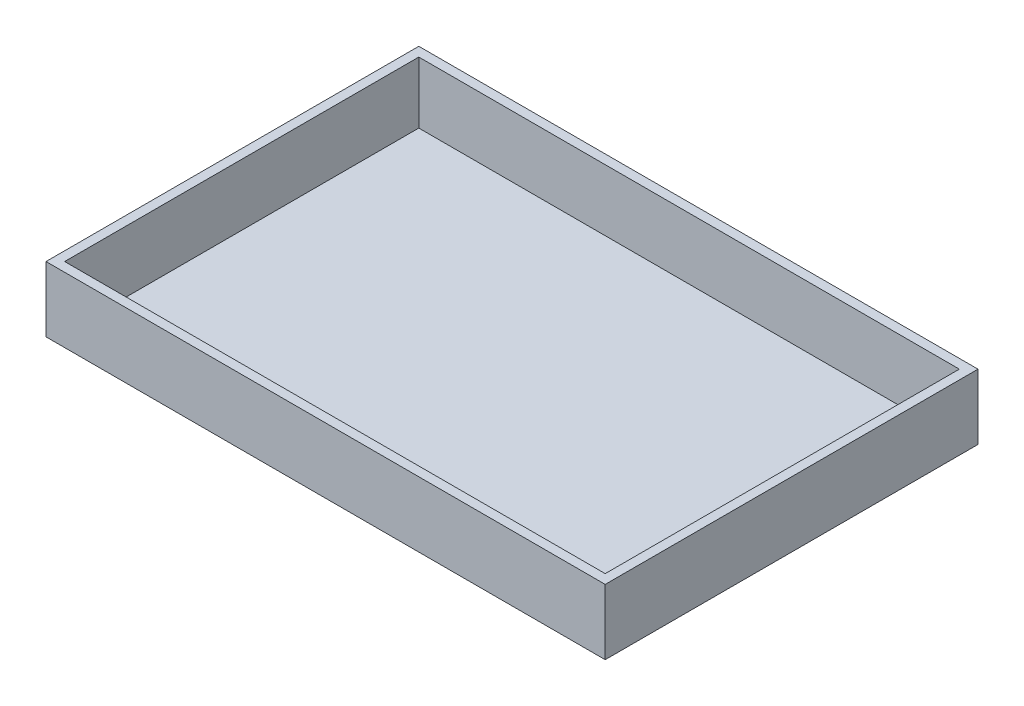
ISO-10303-21;
HEADER;
FILE_DESCRIPTION(('STEP AP214'),'2;1');
FILE_NAME('part.step','',(''),(''),'','','');
FILE_SCHEMA(('AUTOMOTIVE_DESIGN { 1 0 10303 214 1 1 1 1 }'));
ENDSEC;
DATA;
#1=APPLICATION_CONTEXT('core data for automotive mechanical design processes');
#2=APPLICATION_PROTOCOL_DEFINITION('international standard','automotive_design',2000,#1);
#3=PRODUCT_CONTEXT('',#1,'mechanical');
#4=PRODUCT('Part','Part','',(#3));
#5=PRODUCT_RELATED_PRODUCT_CATEGORY('part','',(#4));
#6=PRODUCT_DEFINITION_FORMATION('','',#4);
#7=PRODUCT_DEFINITION_CONTEXT('part definition',#1,'design');
#8=PRODUCT_DEFINITION('design','',#6,#7);
#9=PRODUCT_DEFINITION_SHAPE('','',#8);
#10=(LENGTH_UNIT() NAMED_UNIT(*) SI_UNIT(.MILLI.,.METRE.));
#11=(NAMED_UNIT(*) PLANE_ANGLE_UNIT() SI_UNIT($,.RADIAN.));
#12=(NAMED_UNIT(*) SI_UNIT($,.STERADIAN.) SOLID_ANGLE_UNIT());
#13=UNCERTAINTY_MEASURE_WITH_UNIT(LENGTH_MEASURE(1.E-05),#10,'distance_accuracy_value','');
#14=(GEOMETRIC_REPRESENTATION_CONTEXT(3) GLOBAL_UNCERTAINTY_ASSIGNED_CONTEXT((#13)) GLOBAL_UNIT_ASSIGNED_CONTEXT((#10,
#11,#12)) REPRESENTATION_CONTEXT('',''));
#15=CARTESIAN_POINT('',(0.,0.,0.));
#16=DIRECTION('',(0.,0.,1.));
#17=DIRECTION('',(1.,0.,0.));
#18=AXIS2_PLACEMENT_3D('',#15,#16,#17);
#19=CARTESIAN_POINT('',(-15.,-1.75,20.));
#20=DIRECTION('',(1.,0.,0.));
#21=DIRECTION('',(0.,0.,-1.));
#22=AXIS2_PLACEMENT_3D('',#19,#20,#21);
#23=PLANE('',#22);
#24=DIRECTION('',(0.,-1.,0.));
#25=VECTOR('',#24,1.);
#26=CARTESIAN_POINT('',(-15.,-1.75,0.));
#27=LINE('',#26,#25);
#28=CARTESIAN_POINT('',(-15.,1.75,0.));
#29=VERTEX_POINT('',#28);
#30=CARTESIAN_POINT('',(-15.,-1.75,0.));
#31=VERTEX_POINT('',#30);
#32=EDGE_CURVE('E141',#29,#31,#27,.T.);
#33=ORIENTED_EDGE('',*,*,#32,.T.);
#34=DIRECTION('',(0.,0.,-1.));
#35=VECTOR('',#34,1.);
#36=CARTESIAN_POINT('',(-15.,-1.75,20.));
#37=LINE('',#36,#35);
#38=CARTESIAN_POINT('',(-15.,-1.75,20.));
#39=VERTEX_POINT('',#38);
#40=EDGE_CURVE('E11',#39,#31,#37,.T.);
#41=ORIENTED_EDGE('',*,*,#40,.F.);
#42=DIRECTION('',(0.,-1.,0.));
#43=VECTOR('',#42,1.);
#44=CARTESIAN_POINT('',(-15.,-1.75,20.));
#45=LINE('',#44,#43);
#46=CARTESIAN_POINT('',(-15.,1.75,20.));
#47=VERTEX_POINT('',#46);
#48=EDGE_CURVE('E145',#47,#39,#45,.T.);
#49=ORIENTED_EDGE('',*,*,#48,.F.);
#50=DIRECTION('',(0.,0.,-1.));
#51=VECTOR('',#50,1.);
#52=CARTESIAN_POINT('',(-15.,1.75,20.));
#53=LINE('',#52,#51);
#54=EDGE_CURVE('E151',#47,#29,#53,.T.);
#55=ORIENTED_EDGE('',*,*,#54,.T.);
#56=EDGE_LOOP('',(#33,#41,#49,#55));
#57=FACE_BOUND('',#56,.T.);
#58=ADVANCED_FACE('F33',(#57),#23,.F.);
#59=CARTESIAN_POINT('',(15.,-1.75,20.));
#60=DIRECTION('',(0.,1.,0.));
#61=DIRECTION('',(-1.,0.,0.));
#62=AXIS2_PLACEMENT_3D('',#59,#60,#61);
#63=PLANE('',#62);
#64=DIRECTION('',(1.,0.,0.));
#65=VECTOR('',#64,1.);
#66=CARTESIAN_POINT('',(15.,-1.75,0.));
#67=LINE('',#66,#65);
#68=CARTESIAN_POINT('',(15.,-1.75,0.));
#69=VERTEX_POINT('',#68);
#70=EDGE_CURVE('E154',#31,#69,#67,.T.);
#71=ORIENTED_EDGE('',*,*,#70,.T.);
#72=DIRECTION('',(0.,0.,-1.));
#73=VECTOR('',#72,1.);
#74=CARTESIAN_POINT('',(15.,-1.75,20.));
#75=LINE('',#74,#73);
#76=CARTESIAN_POINT('',(15.,-1.75,20.));
#77=VERTEX_POINT('',#76);
#78=EDGE_CURVE('E40',#77,#69,#75,.T.);
#79=ORIENTED_EDGE('',*,*,#78,.F.);
#80=DIRECTION('',(1.,0.,0.));
#81=VECTOR('',#80,1.);
#82=CARTESIAN_POINT('',(15.,-1.75,20.));
#83=LINE('',#82,#81);
#84=EDGE_CURVE('E84',#39,#77,#83,.T.);
#85=ORIENTED_EDGE('',*,*,#84,.F.);
#86=ORIENTED_EDGE('',*,*,#40,.T.);
#87=EDGE_LOOP('',(#71,#79,#85,#86));
#88=FACE_BOUND('',#87,.T.);
#89=ADVANCED_FACE('F183',(#88),#63,.F.);
#90=CARTESIAN_POINT('',(15.,-1.75,20.));
#91=DIRECTION('',(-1.,0.,0.));
#92=DIRECTION('',(0.,0.,1.));
#93=AXIS2_PLACEMENT_3D('',#90,#91,#92);
#94=PLANE('',#93);
#95=DIRECTION('',(0.,1.,0.));
#96=VECTOR('',#95,1.);
#97=CARTESIAN_POINT('',(15.,-1.75,0.));
#98=LINE('',#97,#96);
#99=CARTESIAN_POINT('',(15.,1.75,0.));
#100=VERTEX_POINT('',#99);
#101=EDGE_CURVE('E156',#69,#100,#98,.T.);
#102=ORIENTED_EDGE('',*,*,#101,.T.);
#103=DIRECTION('',(0.,0.,-1.));
#104=VECTOR('',#103,1.);
#105=CARTESIAN_POINT('',(15.,1.75,20.));
#106=LINE('',#105,#104);
#107=CARTESIAN_POINT('',(15.,1.75,20.));
#108=VERTEX_POINT('',#107);
#109=EDGE_CURVE('E160',#108,#100,#106,.T.);
#110=ORIENTED_EDGE('',*,*,#109,.F.);
#111=DIRECTION('',(0.,1.,0.));
#112=VECTOR('',#111,1.);
#113=CARTESIAN_POINT('',(15.,-1.75,20.));
#114=LINE('',#113,#112);
#115=EDGE_CURVE('E148',#77,#108,#114,.T.);
#116=ORIENTED_EDGE('',*,*,#115,.F.);
#117=ORIENTED_EDGE('',*,*,#78,.T.);
#118=EDGE_LOOP('',(#102,#110,#116,#117));
#119=FACE_BOUND('',#118,.T.);
#120=ADVANCED_FACE('F165',(#119),#94,.F.);
#121=CARTESIAN_POINT('',(15.,1.75,20.));
#122=DIRECTION('',(0.,-1.,0.));
#123=DIRECTION('',(1.,0.,0.));
#124=AXIS2_PLACEMENT_3D('',#121,#122,#123);
#125=PLANE('',#124);
#126=DIRECTION('',(1.,0.,0.));
#127=VECTOR('',#126,1.);
#128=CARTESIAN_POINT('',(14.5,1.75,19.5));
#129=LINE('',#128,#127);
#130=CARTESIAN_POINT('',(-14.5,1.75,19.5));
#131=VERTEX_POINT('',#130);
#132=CARTESIAN_POINT('',(14.5,1.75,19.5));
#133=VERTEX_POINT('',#132);
#134=EDGE_CURVE('E135',#131,#133,#129,.T.);
#135=ORIENTED_EDGE('',*,*,#134,.F.);
#136=DIRECTION('',(0.,0.,1.));
#137=VECTOR('',#136,1.);
#138=CARTESIAN_POINT('',(-14.5,1.75,19.5));
#139=LINE('',#138,#137);
#140=CARTESIAN_POINT('',(-14.5,1.75,0.500000000000003));
#141=VERTEX_POINT('',#140);
#142=EDGE_CURVE('E47',#141,#131,#139,.T.);
#143=ORIENTED_EDGE('',*,*,#142,.F.);
#144=DIRECTION('',(-1.,0.,0.));
#145=VECTOR('',#144,1.);
#146=CARTESIAN_POINT('',(14.5,1.75,0.499999999999999));
#147=LINE('',#146,#145);
#148=CARTESIAN_POINT('',(14.5,1.75,0.499999999999999));
#149=VERTEX_POINT('',#148);
#150=EDGE_CURVE('E126',#149,#141,#147,.T.);
#151=ORIENTED_EDGE('',*,*,#150,.F.);
#152=DIRECTION('',(0.,0.,-1.));
#153=VECTOR('',#152,1.);
#154=CARTESIAN_POINT('',(14.5,1.75,19.5));
#155=LINE('',#154,#153);
#156=EDGE_CURVE('E129',#133,#149,#155,.T.);
#157=ORIENTED_EDGE('',*,*,#156,.F.);
#158=EDGE_LOOP('',(#135,#143,#151,#157));
#159=FACE_BOUND('',#158,.T.);
#160=DIRECTION('',(-1.,0.,0.));
#161=VECTOR('',#160,1.);
#162=CARTESIAN_POINT('',(15.,1.75,0.));
#163=LINE('',#162,#161);
#164=EDGE_CURVE('E77',#100,#29,#163,.T.);
#165=ORIENTED_EDGE('',*,*,#164,.T.);
#166=ORIENTED_EDGE('',*,*,#54,.F.);
#167=DIRECTION('',(-1.,0.,0.));
#168=VECTOR('',#167,1.);
#169=CARTESIAN_POINT('',(15.,1.75,20.));
#170=LINE('',#169,#168);
#171=EDGE_CURVE('E56',#108,#47,#170,.T.);
#172=ORIENTED_EDGE('',*,*,#171,.F.);
#173=ORIENTED_EDGE('',*,*,#109,.T.);
#174=EDGE_LOOP('',(#165,#166,#172,#173));
#175=FACE_BOUND('',#174,.T.);
#176=ADVANCED_FACE('F173',(#159,#175),#125,.F.);
#177=CARTESIAN_POINT('',(0.,0.,20.));
#178=DIRECTION('',(0.,0.,1.));
#179=DIRECTION('',(1.,0.,0.));
#180=AXIS2_PLACEMENT_3D('',#177,#178,#179);
#181=PLANE('',#180);
#182=ORIENTED_EDGE('',*,*,#48,.T.);
#183=ORIENTED_EDGE('',*,*,#84,.T.);
#184=ORIENTED_EDGE('',*,*,#115,.T.);
#185=ORIENTED_EDGE('',*,*,#171,.T.);
#186=EDGE_LOOP('',(#182,#183,#184,#185));
#187=FACE_BOUND('',#186,.T.);
#188=ADVANCED_FACE('F175',(#187),#181,.T.);
#189=CARTESIAN_POINT('',(0.,0.,0.));
#190=DIRECTION('',(0.,0.,1.));
#191=DIRECTION('',(1.,0.,0.));
#192=AXIS2_PLACEMENT_3D('',#189,#190,#191);
#193=PLANE('',#192);
#194=ORIENTED_EDGE('',*,*,#32,.F.);
#195=ORIENTED_EDGE('',*,*,#164,.F.);
#196=ORIENTED_EDGE('',*,*,#101,.F.);
#197=ORIENTED_EDGE('',*,*,#70,.F.);
#198=EDGE_LOOP('',(#194,#195,#196,#197));
#199=FACE_BOUND('',#198,.T.);
#200=ADVANCED_FACE('F169',(#199),#193,.F.);
#201=CARTESIAN_POINT('',(-14.5,-1.55,19.5));
#202=DIRECTION('',(-1.,0.,0.));
#203=DIRECTION('',(0.,-1.,0.));
#204=AXIS2_PLACEMENT_3D('',#201,#202,#203);
#205=PLANE('',#204);
#206=ORIENTED_EDGE('',*,*,#142,.T.);
#207=DIRECTION('',(0.,1.,0.));
#208=VECTOR('',#207,1.);
#209=CARTESIAN_POINT('',(-14.5,-1.55,19.5));
#210=LINE('',#209,#208);
#211=CARTESIAN_POINT('',(-14.5,-1.55,19.5));
#212=VERTEX_POINT('',#211);
#213=EDGE_CURVE('E104',#212,#131,#210,.T.);
#214=ORIENTED_EDGE('',*,*,#213,.F.);
#215=DIRECTION('',(0.,0.,1.));
#216=VECTOR('',#215,1.);
#217=CARTESIAN_POINT('',(-14.5,-1.55,19.5));
#218=LINE('',#217,#216);
#219=CARTESIAN_POINT('',(-14.5,-1.55,0.500000000000003));
#220=VERTEX_POINT('',#219);
#221=EDGE_CURVE('E108',#220,#212,#218,.T.);
#222=ORIENTED_EDGE('',*,*,#221,.F.);
#223=DIRECTION('',(0.,1.,0.));
#224=VECTOR('',#223,1.);
#225=CARTESIAN_POINT('',(-14.5,-1.55,0.500000000000003));
#226=LINE('',#225,#224);
#227=EDGE_CURVE('E139',#220,#141,#226,.T.);
#228=ORIENTED_EDGE('',*,*,#227,.T.);
#229=EDGE_LOOP('',(#206,#214,#222,#228));
#230=FACE_BOUND('',#229,.T.);
#231=ADVANCED_FACE('F106',(#230),#205,.F.);
#232=CARTESIAN_POINT('',(14.5,-1.55,0.499999999999999));
#233=DIRECTION('',(0.,0.,-1.));
#234=DIRECTION('',(-1.,0.,0.));
#235=AXIS2_PLACEMENT_3D('',#232,#233,#234);
#236=PLANE('',#235);
#237=ORIENTED_EDGE('',*,*,#150,.T.);
#238=ORIENTED_EDGE('',*,*,#227,.F.);
#239=DIRECTION('',(-1.,0.,0.));
#240=VECTOR('',#239,1.);
#241=CARTESIAN_POINT('',(14.5,-1.55,0.499999999999999));
#242=LINE('',#241,#240);
#243=CARTESIAN_POINT('',(14.5,-1.55,0.499999999999999));
#244=VERTEX_POINT('',#243);
#245=EDGE_CURVE('E114',#244,#220,#242,.T.);
#246=ORIENTED_EDGE('',*,*,#245,.F.);
#247=DIRECTION('',(0.,1.,0.));
#248=VECTOR('',#247,1.);
#249=CARTESIAN_POINT('',(14.5,-1.55,0.499999999999999));
#250=LINE('',#249,#248);
#251=EDGE_CURVE('E142',#244,#149,#250,.T.);
#252=ORIENTED_EDGE('',*,*,#251,.T.);
#253=EDGE_LOOP('',(#237,#238,#246,#252));
#254=FACE_BOUND('',#253,.T.);
#255=ADVANCED_FACE('F222',(#254),#236,.F.);
#256=CARTESIAN_POINT('',(14.5,-1.55,19.5));
#257=DIRECTION('',(1.,0.,0.));
#258=DIRECTION('',(0.,1.,0.));
#259=AXIS2_PLACEMENT_3D('',#256,#257,#258);
#260=PLANE('',#259);
#261=ORIENTED_EDGE('',*,*,#156,.T.);
#262=ORIENTED_EDGE('',*,*,#251,.F.);
#263=DIRECTION('',(0.,0.,-1.));
#264=VECTOR('',#263,1.);
#265=CARTESIAN_POINT('',(14.5,-1.55,19.5));
#266=LINE('',#265,#264);
#267=CARTESIAN_POINT('',(14.5,-1.55,19.5));
#268=VERTEX_POINT('',#267);
#269=EDGE_CURVE('E122',#268,#244,#266,.T.);
#270=ORIENTED_EDGE('',*,*,#269,.F.);
#271=DIRECTION('',(0.,1.,0.));
#272=VECTOR('',#271,1.);
#273=CARTESIAN_POINT('',(14.5,-1.55,19.5));
#274=LINE('',#273,#272);
#275=EDGE_CURVE('E113',#268,#133,#274,.T.);
#276=ORIENTED_EDGE('',*,*,#275,.T.);
#277=EDGE_LOOP('',(#261,#262,#270,#276));
#278=FACE_BOUND('',#277,.T.);
#279=ADVANCED_FACE('F231',(#278),#260,.F.);
#280=CARTESIAN_POINT('',(14.5,-1.55,19.5));
#281=DIRECTION('',(0.,0.,1.));
#282=DIRECTION('',(1.,0.,0.));
#283=AXIS2_PLACEMENT_3D('',#280,#281,#282);
#284=PLANE('',#283);
#285=ORIENTED_EDGE('',*,*,#134,.T.);
#286=ORIENTED_EDGE('',*,*,#275,.F.);
#287=DIRECTION('',(1.,0.,0.));
#288=VECTOR('',#287,1.);
#289=CARTESIAN_POINT('',(14.5,-1.55,19.5));
#290=LINE('',#289,#288);
#291=EDGE_CURVE('E117',#212,#268,#290,.T.);
#292=ORIENTED_EDGE('',*,*,#291,.F.);
#293=ORIENTED_EDGE('',*,*,#213,.T.);
#294=EDGE_LOOP('',(#285,#286,#292,#293));
#295=FACE_BOUND('',#294,.T.);
#296=ADVANCED_FACE('F118',(#295),#284,.F.);
#297=CARTESIAN_POINT('',(0.,-1.55,0.));
#298=DIRECTION('',(0.,1.,0.));
#299=DIRECTION('',(-1.,0.,0.));
#300=AXIS2_PLACEMENT_3D('',#297,#298,#299);
#301=PLANE('',#300);
#302=ORIENTED_EDGE('',*,*,#221,.T.);
#303=ORIENTED_EDGE('',*,*,#291,.T.);
#304=ORIENTED_EDGE('',*,*,#269,.T.);
#305=ORIENTED_EDGE('',*,*,#245,.T.);
#306=EDGE_LOOP('',(#302,#303,#304,#305));
#307=FACE_BOUND('',#306,.T.);
#308=ADVANCED_FACE('F124',(#307),#301,.T.);
#309=CLOSED_SHELL('',(#58,#89,#120,#176,#188,#200,#231,#255,#279,#296,#308));
#310=MANIFOLD_SOLID_BREP('B2',#309);
#311=ADVANCED_BREP_SHAPE_REPRESENTATION('',(#18,#310),#14);
#312=SHAPE_DEFINITION_REPRESENTATION(#9,#311);
ENDSEC;
END-ISO-10303-21;
